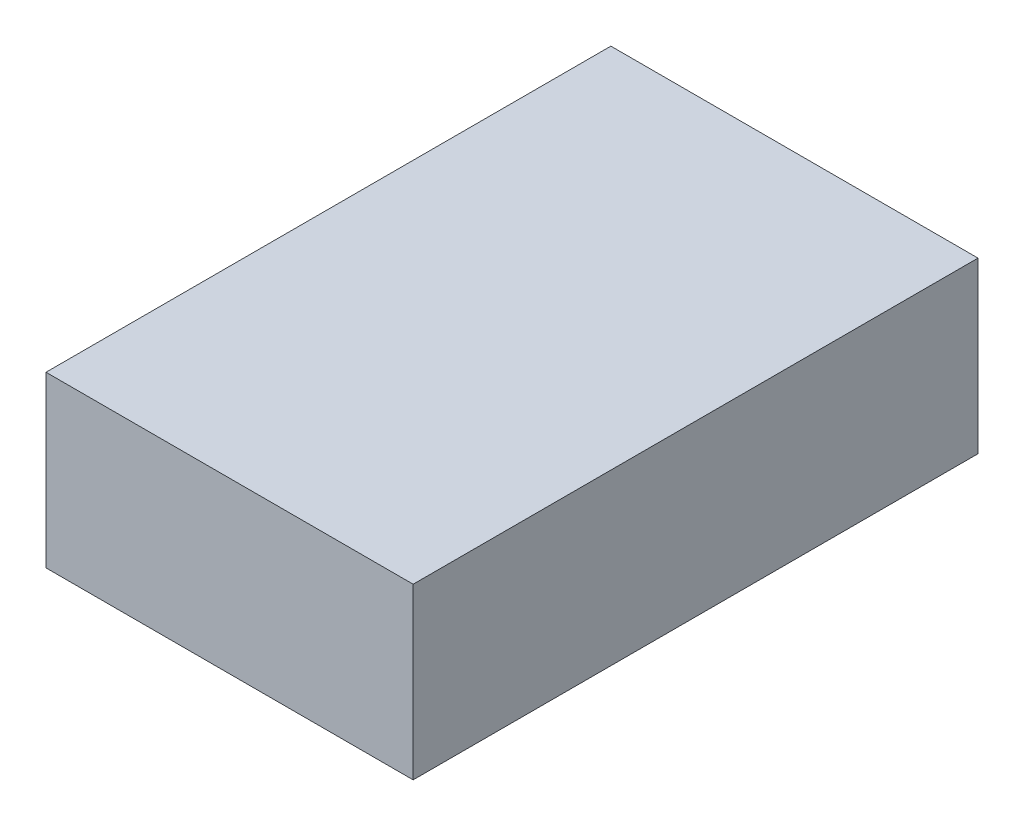
ISO-10303-21;
HEADER;
FILE_DESCRIPTION(('STEP AP214'),'2;1');
FILE_NAME('part.step','',(''),(''),'','','');
FILE_SCHEMA(('AUTOMOTIVE_DESIGN { 1 0 10303 214 1 1 1 1 }'));
ENDSEC;
DATA;
#1=APPLICATION_CONTEXT('core data for automotive mechanical design processes');
#2=APPLICATION_PROTOCOL_DEFINITION('international standard','automotive_design',2000,#1);
#3=PRODUCT_CONTEXT('',#1,'mechanical');
#4=PRODUCT('Part','Part','',(#3));
#5=PRODUCT_RELATED_PRODUCT_CATEGORY('part','',(#4));
#6=PRODUCT_DEFINITION_FORMATION('','',#4);
#7=PRODUCT_DEFINITION_CONTEXT('part definition',#1,'design');
#8=PRODUCT_DEFINITION('design','',#6,#7);
#9=PRODUCT_DEFINITION_SHAPE('','',#8);
#10=(LENGTH_UNIT() NAMED_UNIT(*) SI_UNIT(.MILLI.,.METRE.));
#11=(NAMED_UNIT(*) PLANE_ANGLE_UNIT() SI_UNIT($,.RADIAN.));
#12=(NAMED_UNIT(*) SI_UNIT($,.STERADIAN.) SOLID_ANGLE_UNIT());
#13=UNCERTAINTY_MEASURE_WITH_UNIT(LENGTH_MEASURE(1.E-05),#10,'distance_accuracy_value','');
#14=(GEOMETRIC_REPRESENTATION_CONTEXT(3) GLOBAL_UNCERTAINTY_ASSIGNED_CONTEXT((#13)) GLOBAL_UNIT_ASSIGNED_CONTEXT((#10,
#11,#12)) REPRESENTATION_CONTEXT('',''));
#15=CARTESIAN_POINT('',(0.,0.,0.));
#16=DIRECTION('',(0.,0.,1.));
#17=DIRECTION('',(1.,0.,0.));
#18=AXIS2_PLACEMENT_3D('',#15,#16,#17);
#19=CARTESIAN_POINT('',(0.,76.2,-254.));
#20=DIRECTION('',(0.,0.,-1.));
#21=DIRECTION('',(-1.,0.,0.));
#22=AXIS2_PLACEMENT_3D('',#19,#20,#21);
#23=PLANE('',#22);
#24=DIRECTION('',(1.,0.,0.));
#25=VECTOR('',#24,1.);
#26=CARTESIAN_POINT('',(0.,0.,-254.));
#27=LINE('',#26,#25);
#28=CARTESIAN_POINT('',(0.,0.,-254.));
#29=VERTEX_POINT('',#28);
#30=CARTESIAN_POINT('',(165.1,0.,-254.));
#31=VERTEX_POINT('',#30);
#32=EDGE_CURVE('E115',#29,#31,#27,.T.);
#33=ORIENTED_EDGE('',*,*,#32,.F.);
#34=DIRECTION('',(0.,-1.,0.));
#35=VECTOR('',#34,1.);
#36=CARTESIAN_POINT('',(0.,76.2,-254.));
#37=LINE('',#36,#35);
#38=CARTESIAN_POINT('',(0.,76.2,-254.));
#39=VERTEX_POINT('',#38);
#40=EDGE_CURVE('E11',#39,#29,#37,.T.);
#41=ORIENTED_EDGE('',*,*,#40,.F.);
#42=DIRECTION('',(1.,0.,0.));
#43=VECTOR('',#42,1.);
#44=CARTESIAN_POINT('',(0.,76.2,-254.));
#45=LINE('',#44,#43);
#46=CARTESIAN_POINT('',(165.1,76.2,-254.));
#47=VERTEX_POINT('',#46);
#48=EDGE_CURVE('E107',#39,#47,#45,.T.);
#49=ORIENTED_EDGE('',*,*,#48,.T.);
#50=DIRECTION('',(0.,-1.,0.));
#51=VECTOR('',#50,1.);
#52=CARTESIAN_POINT('',(165.1,76.2,-254.));
#53=LINE('',#52,#51);
#54=EDGE_CURVE('E48',#47,#31,#53,.T.);
#55=ORIENTED_EDGE('',*,*,#54,.T.);
#56=EDGE_LOOP('',(#33,#41,#49,#55));
#57=FACE_BOUND('',#56,.T.);
#58=ADVANCED_FACE('F45',(#57),#23,.T.);
#59=CARTESIAN_POINT('',(0.,76.2,0.));
#60=DIRECTION('',(-1.,0.,0.));
#61=DIRECTION('',(0.,0.,1.));
#62=AXIS2_PLACEMENT_3D('',#59,#60,#61);
#63=PLANE('',#62);
#64=DIRECTION('',(0.,0.,-1.));
#65=VECTOR('',#64,1.);
#66=CARTESIAN_POINT('',(0.,0.,0.));
#67=LINE('',#66,#65);
#68=CARTESIAN_POINT('',(0.,0.,0.));
#69=VERTEX_POINT('',#68);
#70=EDGE_CURVE('E110',#69,#29,#67,.T.);
#71=ORIENTED_EDGE('',*,*,#70,.F.);
#72=DIRECTION('',(0.,-1.,0.));
#73=VECTOR('',#72,1.);
#74=CARTESIAN_POINT('',(0.,76.2,0.));
#75=LINE('',#74,#73);
#76=CARTESIAN_POINT('',(0.,76.2,0.));
#77=VERTEX_POINT('',#76);
#78=EDGE_CURVE('E55',#77,#69,#75,.T.);
#79=ORIENTED_EDGE('',*,*,#78,.F.);
#80=DIRECTION('',(0.,0.,-1.));
#81=VECTOR('',#80,1.);
#82=CARTESIAN_POINT('',(0.,76.2,0.));
#83=LINE('',#82,#81);
#84=EDGE_CURVE('E94',#77,#39,#83,.T.);
#85=ORIENTED_EDGE('',*,*,#84,.T.);
#86=ORIENTED_EDGE('',*,*,#40,.T.);
#87=EDGE_LOOP('',(#71,#79,#85,#86));
#88=FACE_BOUND('',#87,.T.);
#89=ADVANCED_FACE('F131',(#88),#63,.T.);
#90=CARTESIAN_POINT('',(0.,76.2,0.));
#91=DIRECTION('',(0.,0.,-1.));
#92=DIRECTION('',(-1.,0.,0.));
#93=AXIS2_PLACEMENT_3D('',#90,#91,#92);
#94=PLANE('',#93);
#95=DIRECTION('',(1.,0.,0.));
#96=VECTOR('',#95,1.);
#97=CARTESIAN_POINT('',(0.,0.,0.));
#98=LINE('',#97,#96);
#99=CARTESIAN_POINT('',(165.1,0.,0.));
#100=VERTEX_POINT('',#99);
#101=EDGE_CURVE('E100',#69,#100,#98,.T.);
#102=ORIENTED_EDGE('',*,*,#101,.T.);
#103=DIRECTION('',(0.,-1.,0.));
#104=VECTOR('',#103,1.);
#105=CARTESIAN_POINT('',(165.1,76.2,0.));
#106=LINE('',#105,#104);
#107=CARTESIAN_POINT('',(165.1,76.2,0.));
#108=VERTEX_POINT('',#107);
#109=EDGE_CURVE('E98',#108,#100,#106,.T.);
#110=ORIENTED_EDGE('',*,*,#109,.F.);
#111=DIRECTION('',(1.,0.,0.));
#112=VECTOR('',#111,1.);
#113=CARTESIAN_POINT('',(0.,76.2,0.));
#114=LINE('',#113,#112);
#115=EDGE_CURVE('E91',#77,#108,#114,.T.);
#116=ORIENTED_EDGE('',*,*,#115,.F.);
#117=ORIENTED_EDGE('',*,*,#78,.T.);
#118=EDGE_LOOP('',(#102,#110,#116,#117));
#119=FACE_BOUND('',#118,.T.);
#120=ADVANCED_FACE('F99',(#119),#94,.F.);
#121=CARTESIAN_POINT('',(165.1,76.2,0.));
#122=DIRECTION('',(-1.,0.,0.));
#123=DIRECTION('',(0.,0.,1.));
#124=AXIS2_PLACEMENT_3D('',#121,#122,#123);
#125=PLANE('',#124);
#126=DIRECTION('',(0.,0.,-1.));
#127=VECTOR('',#126,1.);
#128=CARTESIAN_POINT('',(165.1,0.,0.));
#129=LINE('',#128,#127);
#130=EDGE_CURVE('E119',#100,#31,#129,.T.);
#131=ORIENTED_EDGE('',*,*,#130,.T.);
#132=ORIENTED_EDGE('',*,*,#54,.F.);
#133=DIRECTION('',(0.,0.,-1.));
#134=VECTOR('',#133,1.);
#135=CARTESIAN_POINT('',(165.1,76.2,0.));
#136=LINE('',#135,#134);
#137=EDGE_CURVE('E88',#108,#47,#136,.T.);
#138=ORIENTED_EDGE('',*,*,#137,.F.);
#139=ORIENTED_EDGE('',*,*,#109,.T.);
#140=EDGE_LOOP('',(#131,#132,#138,#139));
#141=FACE_BOUND('',#140,.T.);
#142=ADVANCED_FACE('F105',(#141),#125,.F.);
#143=CARTESIAN_POINT('',(0.,76.2,0.));
#144=DIRECTION('',(0.,1.,0.));
#145=DIRECTION('',(0.,0.,1.));
#146=AXIS2_PLACEMENT_3D('',#143,#144,#145);
#147=PLANE('',#146);
#148=ORIENTED_EDGE('',*,*,#48,.F.);
#149=ORIENTED_EDGE('',*,*,#84,.F.);
#150=ORIENTED_EDGE('',*,*,#115,.T.);
#151=ORIENTED_EDGE('',*,*,#137,.T.);
#152=EDGE_LOOP('',(#148,#149,#150,#151));
#153=FACE_BOUND('',#152,.T.);
#154=ADVANCED_FACE('F93',(#153),#147,.T.);
#155=CARTESIAN_POINT('',(0.,0.,0.));
#156=DIRECTION('',(0.,1.,0.));
#157=DIRECTION('',(0.,0.,1.));
#158=AXIS2_PLACEMENT_3D('',#155,#156,#157);
#159=PLANE('',#158);
#160=ORIENTED_EDGE('',*,*,#32,.T.);
#161=ORIENTED_EDGE('',*,*,#130,.F.);
#162=ORIENTED_EDGE('',*,*,#101,.F.);
#163=ORIENTED_EDGE('',*,*,#70,.T.);
#164=EDGE_LOOP('',(#160,#161,#162,#163));
#165=FACE_BOUND('',#164,.T.);
#166=ADVANCED_FACE('F130',(#165),#159,.F.);
#167=CLOSED_SHELL('',(#58,#89,#120,#142,#154,#166));
#168=MANIFOLD_SOLID_BREP('B2',#167);
#169=ADVANCED_BREP_SHAPE_REPRESENTATION('',(#18,#168),#14);
#170=SHAPE_DEFINITION_REPRESENTATION(#9,#169);
ENDSEC;
END-ISO-10303-21;
